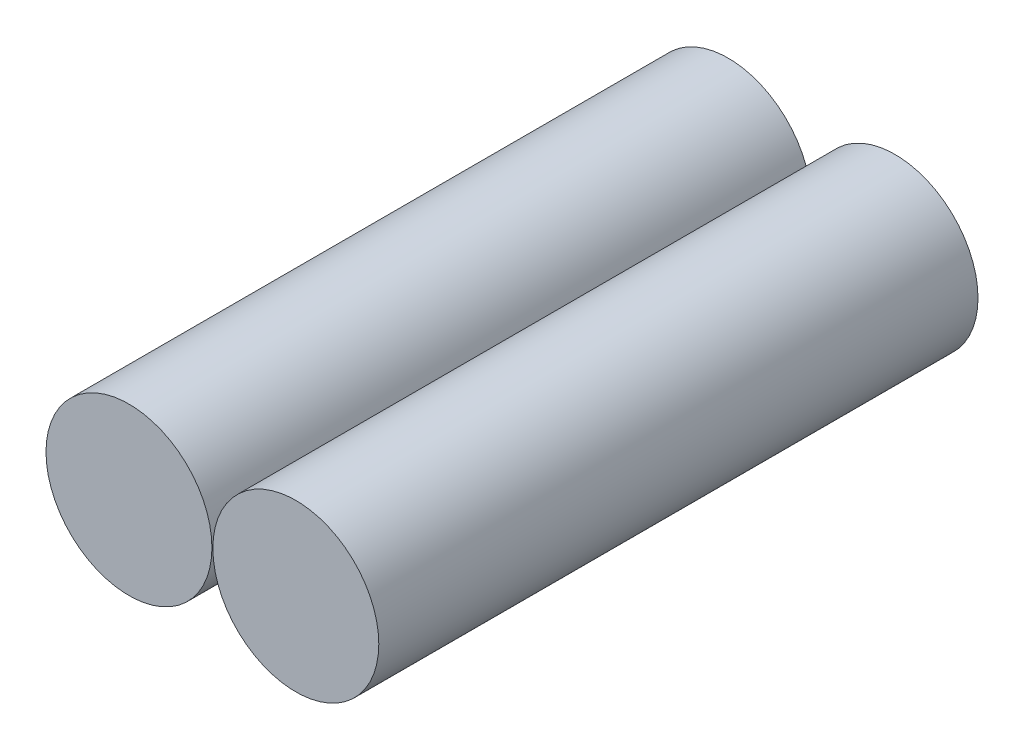
ISO-10303-21;
HEADER;
FILE_DESCRIPTION(('STEP AP214'),'2;1');
FILE_NAME('part.step','',(''),(''),'','','');
FILE_SCHEMA(('AUTOMOTIVE_DESIGN { 1 0 10303 214 1 1 1 1 }'));
ENDSEC;
DATA;
#1=APPLICATION_CONTEXT('core data for automotive mechanical design processes');
#2=APPLICATION_PROTOCOL_DEFINITION('international standard','automotive_design',2000,#1);
#3=PRODUCT_CONTEXT('',#1,'mechanical');
#4=PRODUCT('Part','Part','',(#3));
#5=PRODUCT_RELATED_PRODUCT_CATEGORY('part','',(#4));
#6=PRODUCT_DEFINITION_FORMATION('','',#4);
#7=PRODUCT_DEFINITION_CONTEXT('part definition',#1,'design');
#8=PRODUCT_DEFINITION('design','',#6,#7);
#9=PRODUCT_DEFINITION_SHAPE('','',#8);
#10=(LENGTH_UNIT() NAMED_UNIT(*) SI_UNIT(.MILLI.,.METRE.));
#11=(NAMED_UNIT(*) PLANE_ANGLE_UNIT() SI_UNIT($,.RADIAN.));
#12=(NAMED_UNIT(*) SI_UNIT($,.STERADIAN.) SOLID_ANGLE_UNIT());
#13=UNCERTAINTY_MEASURE_WITH_UNIT(LENGTH_MEASURE(1.E-05),#10,'distance_accuracy_value','');
#14=(GEOMETRIC_REPRESENTATION_CONTEXT(3) GLOBAL_UNCERTAINTY_ASSIGNED_CONTEXT((#13)) GLOBAL_UNIT_ASSIGNED_CONTEXT((#10,
#11,#12)) REPRESENTATION_CONTEXT('',''));
#15=CARTESIAN_POINT('',(0.,0.,0.));
#16=DIRECTION('',(0.,0.,1.));
#17=DIRECTION('',(1.,0.,0.));
#18=AXIS2_PLACEMENT_3D('',#15,#16,#17);
#19=CARTESIAN_POINT('',(18.1,0.,65.));
#20=DIRECTION('',(0.,0.,-1.));
#21=DIRECTION('',(-1.,0.,0.));
#22=AXIS2_PLACEMENT_3D('',#19,#20,#21);
#23=CYLINDRICAL_SURFACE('',#22,9.);
#24=CARTESIAN_POINT('',(18.1,0.,65.));
#25=DIRECTION('',(0.,0.,1.));
#26=DIRECTION('',(1.,0.,0.));
#27=AXIS2_PLACEMENT_3D('',#24,#25,#26);
#28=CIRCLE('',#27,9.);
#29=CARTESIAN_POINT('',(27.1,0.,65.));
#30=VERTEX_POINT('',#29);
#31=EDGE_CURVE('E11',#30,#30,#28,.T.);
#32=ORIENTED_EDGE('',*,*,#31,.F.);
#33=EDGE_LOOP('',(#32));
#34=FACE_BOUND('',#33,.T.);
#35=CARTESIAN_POINT('',(18.1,0.,0.));
#36=DIRECTION('',(0.,0.,1.));
#37=DIRECTION('',(1.,0.,0.));
#38=AXIS2_PLACEMENT_3D('',#35,#36,#37);
#39=CIRCLE('',#38,9.);
#40=CARTESIAN_POINT('',(27.1,0.,0.));
#41=VERTEX_POINT('',#40);
#42=EDGE_CURVE('E44',#41,#41,#39,.T.);
#43=ORIENTED_EDGE('',*,*,#42,.T.);
#44=EDGE_LOOP('',(#43));
#45=FACE_BOUND('',#44,.T.);
#46=ADVANCED_FACE('F41',(#34,#45),#23,.T.);
#47=CARTESIAN_POINT('',(18.1,0.,65.));
#48=DIRECTION('',(0.,0.,1.));
#49=DIRECTION('',(1.,0.,0.));
#50=AXIS2_PLACEMENT_3D('',#47,#48,#49);
#51=PLANE('',#50);
#52=ORIENTED_EDGE('',*,*,#31,.T.);
#53=EDGE_LOOP('',(#52));
#54=FACE_BOUND('',#53,.T.);
#55=ADVANCED_FACE('F56',(#54),#51,.T.);
#56=CARTESIAN_POINT('',(18.1,0.,0.));
#57=DIRECTION('',(0.,0.,1.));
#58=DIRECTION('',(1.,0.,0.));
#59=AXIS2_PLACEMENT_3D('',#56,#57,#58);
#60=PLANE('',#59);
#61=ORIENTED_EDGE('',*,*,#42,.F.);
#62=EDGE_LOOP('',(#61));
#63=FACE_BOUND('',#62,.T.);
#64=ADVANCED_FACE('F54',(#63),#60,.F.);
#65=CLOSED_SHELL('',(#46,#55,#64));
#66=MANIFOLD_SOLID_BREP('B2',#65);
#67=CARTESIAN_POINT('',(0.,0.,65.));
#68=DIRECTION('',(0.,0.,-1.));
#69=DIRECTION('',(-1.,0.,0.));
#70=AXIS2_PLACEMENT_3D('',#67,#68,#69);
#71=CYLINDRICAL_SURFACE('',#70,9.);
#72=CARTESIAN_POINT('',(0.,0.,65.));
#73=DIRECTION('',(0.,0.,1.));
#74=DIRECTION('',(1.,0.,0.));
#75=AXIS2_PLACEMENT_3D('',#72,#73,#74);
#76=CIRCLE('',#75,9.);
#77=CARTESIAN_POINT('',(9.,0.,65.));
#78=VERTEX_POINT('',#77);
#79=EDGE_CURVE('E40',#78,#78,#76,.T.);
#80=ORIENTED_EDGE('',*,*,#79,.F.);
#81=EDGE_LOOP('',(#80));
#82=FACE_BOUND('',#81,.T.);
#83=CARTESIAN_POINT('',(0.,0.,0.));
#84=DIRECTION('',(0.,0.,1.));
#85=DIRECTION('',(1.,0.,0.));
#86=AXIS2_PLACEMENT_3D('',#83,#84,#85);
#87=CIRCLE('',#86,9.);
#88=CARTESIAN_POINT('',(9.,0.,0.));
#89=VERTEX_POINT('',#88);
#90=EDGE_CURVE('E85',#89,#89,#87,.T.);
#91=ORIENTED_EDGE('',*,*,#90,.T.);
#92=EDGE_LOOP('',(#91));
#93=FACE_BOUND('',#92,.T.);
#94=ADVANCED_FACE('F82',(#82,#93),#71,.T.);
#95=CARTESIAN_POINT('',(0.,0.,65.));
#96=DIRECTION('',(0.,0.,1.));
#97=DIRECTION('',(1.,0.,0.));
#98=AXIS2_PLACEMENT_3D('',#95,#96,#97);
#99=PLANE('',#98);
#100=ORIENTED_EDGE('',*,*,#79,.T.);
#101=EDGE_LOOP('',(#100));
#102=FACE_BOUND('',#101,.T.);
#103=ADVANCED_FACE('F97',(#102),#99,.T.);
#104=CARTESIAN_POINT('',(0.,0.,0.));
#105=DIRECTION('',(0.,0.,1.));
#106=DIRECTION('',(1.,0.,0.));
#107=AXIS2_PLACEMENT_3D('',#104,#105,#106);
#108=PLANE('',#107);
#109=ORIENTED_EDGE('',*,*,#90,.F.);
#110=EDGE_LOOP('',(#109));
#111=FACE_BOUND('',#110,.T.);
#112=ADVANCED_FACE('F95',(#111),#108,.F.);
#113=CLOSED_SHELL('',(#94,#103,#112));
#114=MANIFOLD_SOLID_BREP('B6',#113);
#115=ADVANCED_BREP_SHAPE_REPRESENTATION('',(#18,#66,#114),#14);
#116=SHAPE_DEFINITION_REPRESENTATION(#9,#115);
ENDSEC;
END-ISO-10303-21;
